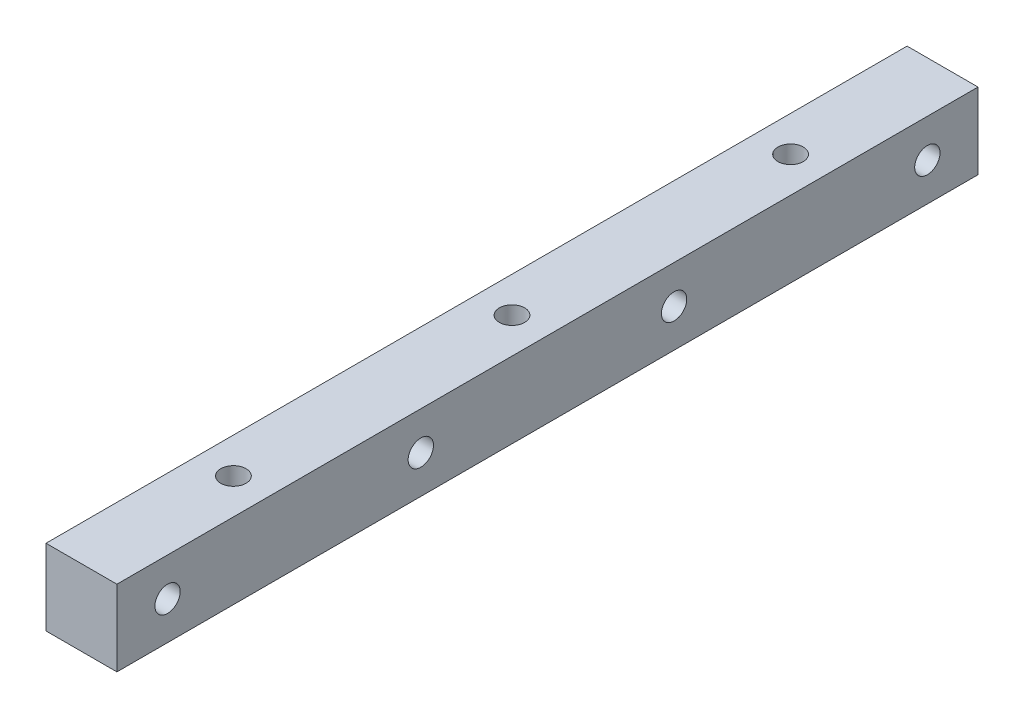
ISO-10303-21;
HEADER;
FILE_DESCRIPTION(('STEP AP214'),'2;1');
FILE_NAME('part.step','',(''),(''),'','','');
FILE_SCHEMA(('AUTOMOTIVE_DESIGN { 1 0 10303 214 1 1 1 1 }'));
ENDSEC;
DATA;
#1=APPLICATION_CONTEXT('core data for automotive mechanical design processes');
#2=APPLICATION_PROTOCOL_DEFINITION('international standard','automotive_design',2000,#1);
#3=PRODUCT_CONTEXT('',#1,'mechanical');
#4=PRODUCT('Part','Part','',(#3));
#5=PRODUCT_RELATED_PRODUCT_CATEGORY('part','',(#4));
#6=PRODUCT_DEFINITION_FORMATION('','',#4);
#7=PRODUCT_DEFINITION_CONTEXT('part definition',#1,'design');
#8=PRODUCT_DEFINITION('design','',#6,#7);
#9=PRODUCT_DEFINITION_SHAPE('','',#8);
#10=(LENGTH_UNIT() NAMED_UNIT(*) SI_UNIT(.MILLI.,.METRE.));
#11=(NAMED_UNIT(*) PLANE_ANGLE_UNIT() SI_UNIT($,.RADIAN.));
#12=(NAMED_UNIT(*) SI_UNIT($,.STERADIAN.) SOLID_ANGLE_UNIT());
#13=UNCERTAINTY_MEASURE_WITH_UNIT(LENGTH_MEASURE(1.E-05),#10,'distance_accuracy_value','');
#14=(GEOMETRIC_REPRESENTATION_CONTEXT(3) GLOBAL_UNCERTAINTY_ASSIGNED_CONTEXT((#13)) GLOBAL_UNIT_ASSIGNED_CONTEXT((#10,
#11,#12)) REPRESENTATION_CONTEXT('',''));
#15=CARTESIAN_POINT('',(0.,0.,0.));
#16=DIRECTION('',(0.,0.,1.));
#17=DIRECTION('',(1.,0.,0.));
#18=AXIS2_PLACEMENT_3D('',#15,#16,#17);
#19=CARTESIAN_POINT('',(2.8,0.,34.));
#20=DIRECTION('',(0.,1.,0.));
#21=DIRECTION('',(-1.,0.,0.));
#22=AXIS2_PLACEMENT_3D('',#19,#20,#21);
#23=PLANE('',#22);
#24=CARTESIAN_POINT('',(0.,0.,-22.));
#25=DIRECTION('',(0.,-1.,0.));
#26=DIRECTION('',(1.,0.,0.));
#27=AXIS2_PLACEMENT_3D('',#24,#25,#26);
#28=CIRCLE('',#27,1.);
#29=CARTESIAN_POINT('',(1.,0.,-22.));
#30=VERTEX_POINT('',#29);
#31=EDGE_CURVE('E121',#30,#30,#28,.T.);
#32=ORIENTED_EDGE('',*,*,#31,.F.);
#33=EDGE_LOOP('',(#32));
#34=FACE_BOUND('',#33,.T.);
#35=CARTESIAN_POINT('',(0.,0.,22.));
#36=DIRECTION('',(0.,-1.,0.));
#37=DIRECTION('',(1.,0.,0.));
#38=AXIS2_PLACEMENT_3D('',#35,#36,#37);
#39=CIRCLE('',#38,1.);
#40=CARTESIAN_POINT('',(1.,0.,22.));
#41=VERTEX_POINT('',#40);
#42=EDGE_CURVE('E120',#41,#41,#39,.T.);
#43=ORIENTED_EDGE('',*,*,#42,.F.);
#44=EDGE_LOOP('',(#43));
#45=FACE_BOUND('',#44,.T.);
#46=CARTESIAN_POINT('',(0.,0.,0.));
#47=DIRECTION('',(0.,-1.,0.));
#48=DIRECTION('',(1.,0.,0.));
#49=AXIS2_PLACEMENT_3D('',#46,#47,#48);
#50=CIRCLE('',#49,1.);
#51=CARTESIAN_POINT('',(1.,0.,0.));
#52=VERTEX_POINT('',#51);
#53=EDGE_CURVE('E113',#52,#52,#50,.T.);
#54=ORIENTED_EDGE('',*,*,#53,.F.);
#55=EDGE_LOOP('',(#54));
#56=FACE_BOUND('',#55,.T.);
#57=DIRECTION('',(1.,0.,0.));
#58=VECTOR('',#57,1.);
#59=CARTESIAN_POINT('',(2.8,0.,-34.));
#60=LINE('',#59,#58);
#61=CARTESIAN_POINT('',(-2.8,0.,-34.));
#62=VERTEX_POINT('',#61);
#63=CARTESIAN_POINT('',(2.8,0.,-34.));
#64=VERTEX_POINT('',#63);
#65=EDGE_CURVE('E97',#62,#64,#60,.T.);
#66=ORIENTED_EDGE('',*,*,#65,.T.);
#67=DIRECTION('',(0.,0.,-1.));
#68=VECTOR('',#67,1.);
#69=CARTESIAN_POINT('',(2.8,0.,34.));
#70=LINE('',#69,#68);
#71=CARTESIAN_POINT('',(2.8,0.,34.));
#72=VERTEX_POINT('',#71);
#73=EDGE_CURVE('E11',#72,#64,#70,.T.);
#74=ORIENTED_EDGE('',*,*,#73,.F.);
#75=DIRECTION('',(1.,0.,0.));
#76=VECTOR('',#75,1.);
#77=CARTESIAN_POINT('',(2.8,0.,34.));
#78=LINE('',#77,#76);
#79=CARTESIAN_POINT('',(-2.8,0.,34.));
#80=VERTEX_POINT('',#79);
#81=EDGE_CURVE('E85',#80,#72,#78,.T.);
#82=ORIENTED_EDGE('',*,*,#81,.F.);
#83=DIRECTION('',(0.,0.,-1.));
#84=VECTOR('',#83,1.);
#85=CARTESIAN_POINT('',(-2.8,0.,34.));
#86=LINE('',#85,#84);
#87=EDGE_CURVE('E93',#80,#62,#86,.T.);
#88=ORIENTED_EDGE('',*,*,#87,.T.);
#89=EDGE_LOOP('',(#66,#74,#82,#88));
#90=FACE_BOUND('',#89,.T.);
#91=ADVANCED_FACE('F34',(#34,#45,#56,#90),#23,.F.);
#92=CARTESIAN_POINT('',(2.8,6.,34.));
#93=DIRECTION('',(-1.,0.,0.));
#94=DIRECTION('',(0.,-1.,0.));
#95=AXIS2_PLACEMENT_3D('',#92,#93,#94);
#96=PLANE('',#95);
#97=CARTESIAN_POINT('',(2.8,3.,30.));
#98=DIRECTION('',(1.,0.,0.));
#99=DIRECTION('',(0.,1.,0.));
#100=AXIS2_PLACEMENT_3D('',#97,#98,#99);
#101=CIRCLE('',#100,1.);
#102=CARTESIAN_POINT('',(2.8,4.,30.));
#103=VERTEX_POINT('',#102);
#104=EDGE_CURVE('E145',#103,#103,#101,.T.);
#105=ORIENTED_EDGE('',*,*,#104,.F.);
#106=EDGE_LOOP('',(#105));
#107=FACE_BOUND('',#106,.T.);
#108=CARTESIAN_POINT('',(2.8,3.,10.));
#109=DIRECTION('',(1.,0.,0.));
#110=DIRECTION('',(0.,1.,0.));
#111=AXIS2_PLACEMENT_3D('',#108,#109,#110);
#112=CIRCLE('',#111,1.);
#113=CARTESIAN_POINT('',(2.8,4.,10.));
#114=VERTEX_POINT('',#113);
#115=EDGE_CURVE('E139',#114,#114,#112,.T.);
#116=ORIENTED_EDGE('',*,*,#115,.F.);
#117=EDGE_LOOP('',(#116));
#118=FACE_BOUND('',#117,.T.);
#119=CARTESIAN_POINT('',(2.8,3.,-10.));
#120=DIRECTION('',(1.,0.,0.));
#121=DIRECTION('',(0.,-1.,0.));
#122=AXIS2_PLACEMENT_3D('',#119,#120,#121);
#123=CIRCLE('',#122,1.);
#124=CARTESIAN_POINT('',(2.8,2.,-10.));
#125=VERTEX_POINT('',#124);
#126=EDGE_CURVE('E132',#125,#125,#123,.T.);
#127=ORIENTED_EDGE('',*,*,#126,.F.);
#128=EDGE_LOOP('',(#127));
#129=FACE_BOUND('',#128,.T.);
#130=CARTESIAN_POINT('',(2.8,3.,-30.));
#131=DIRECTION('',(1.,0.,0.));
#132=DIRECTION('',(0.,-1.,0.));
#133=AXIS2_PLACEMENT_3D('',#130,#131,#132);
#134=CIRCLE('',#133,1.);
#135=CARTESIAN_POINT('',(2.8,2.,-30.));
#136=VERTEX_POINT('',#135);
#137=EDGE_CURVE('E133',#136,#136,#134,.T.);
#138=ORIENTED_EDGE('',*,*,#137,.F.);
#139=EDGE_LOOP('',(#138));
#140=FACE_BOUND('',#139,.T.);
#141=DIRECTION('',(0.,1.,0.));
#142=VECTOR('',#141,1.);
#143=CARTESIAN_POINT('',(2.8,6.,-34.));
#144=LINE('',#143,#142);
#145=CARTESIAN_POINT('',(2.8,6.,-34.));
#146=VERTEX_POINT('',#145);
#147=EDGE_CURVE('E89',#64,#146,#144,.T.);
#148=ORIENTED_EDGE('',*,*,#147,.T.);
#149=DIRECTION('',(0.,0.,-1.));
#150=VECTOR('',#149,1.);
#151=CARTESIAN_POINT('',(2.8,6.,34.));
#152=LINE('',#151,#150);
#153=CARTESIAN_POINT('',(2.8,6.,34.));
#154=VERTEX_POINT('',#153);
#155=EDGE_CURVE('E42',#154,#146,#152,.T.);
#156=ORIENTED_EDGE('',*,*,#155,.F.);
#157=DIRECTION('',(0.,1.,0.));
#158=VECTOR('',#157,1.);
#159=CARTESIAN_POINT('',(2.8,6.,34.));
#160=LINE('',#159,#158);
#161=EDGE_CURVE('E80',#72,#154,#160,.T.);
#162=ORIENTED_EDGE('',*,*,#161,.F.);
#163=ORIENTED_EDGE('',*,*,#73,.T.);
#164=EDGE_LOOP('',(#148,#156,#162,#163));
#165=FACE_BOUND('',#164,.T.);
#166=ADVANCED_FACE('F88',(#107,#118,#129,#140,#165),#96,.F.);
#167=CARTESIAN_POINT('',(-2.8,6.,34.));
#168=DIRECTION('',(0.,-1.,0.));
#169=DIRECTION('',(1.,0.,0.));
#170=AXIS2_PLACEMENT_3D('',#167,#168,#169);
#171=PLANE('',#170);
#172=CARTESIAN_POINT('',(0.,6.,-22.));
#173=DIRECTION('',(0.,-1.,0.));
#174=DIRECTION('',(1.,0.,0.));
#175=AXIS2_PLACEMENT_3D('',#172,#173,#174);
#176=CIRCLE('',#175,1.);
#177=CARTESIAN_POINT('',(1.,6.,-22.));
#178=VERTEX_POINT('',#177);
#179=EDGE_CURVE('E117',#178,#178,#176,.F.);
#180=ORIENTED_EDGE('',*,*,#179,.F.);
#181=EDGE_LOOP('',(#180));
#182=FACE_BOUND('',#181,.T.);
#183=CARTESIAN_POINT('',(0.,6.,22.));
#184=DIRECTION('',(0.,-1.,0.));
#185=DIRECTION('',(1.,0.,0.));
#186=AXIS2_PLACEMENT_3D('',#183,#184,#185);
#187=CIRCLE('',#186,1.);
#188=CARTESIAN_POINT('',(1.,6.,22.));
#189=VERTEX_POINT('',#188);
#190=EDGE_CURVE('E116',#189,#189,#187,.F.);
#191=ORIENTED_EDGE('',*,*,#190,.F.);
#192=EDGE_LOOP('',(#191));
#193=FACE_BOUND('',#192,.T.);
#194=CARTESIAN_POINT('',(0.,6.,0.));
#195=DIRECTION('',(0.,-1.,0.));
#196=DIRECTION('',(1.,0.,0.));
#197=AXIS2_PLACEMENT_3D('',#194,#195,#196);
#198=CIRCLE('',#197,1.);
#199=CARTESIAN_POINT('',(1.,6.,0.));
#200=VERTEX_POINT('',#199);
#201=EDGE_CURVE('E100',#200,#200,#198,.F.);
#202=ORIENTED_EDGE('',*,*,#201,.F.);
#203=EDGE_LOOP('',(#202));
#204=FACE_BOUND('',#203,.T.);
#205=DIRECTION('',(-1.,0.,0.));
#206=VECTOR('',#205,1.);
#207=CARTESIAN_POINT('',(-2.8,6.,-34.));
#208=LINE('',#207,#206);
#209=CARTESIAN_POINT('',(-2.8,6.,-34.));
#210=VERTEX_POINT('',#209);
#211=EDGE_CURVE('E67',#146,#210,#208,.T.);
#212=ORIENTED_EDGE('',*,*,#211,.T.);
#213=DIRECTION('',(0.,0.,-1.));
#214=VECTOR('',#213,1.);
#215=CARTESIAN_POINT('',(-2.8,6.,34.));
#216=LINE('',#215,#214);
#217=CARTESIAN_POINT('',(-2.8,6.,34.));
#218=VERTEX_POINT('',#217);
#219=EDGE_CURVE('E90',#218,#210,#216,.T.);
#220=ORIENTED_EDGE('',*,*,#219,.F.);
#221=DIRECTION('',(-1.,0.,0.));
#222=VECTOR('',#221,1.);
#223=CARTESIAN_POINT('',(-2.8,6.,34.));
#224=LINE('',#223,#222);
#225=EDGE_CURVE('E83',#154,#218,#224,.T.);
#226=ORIENTED_EDGE('',*,*,#225,.F.);
#227=ORIENTED_EDGE('',*,*,#155,.T.);
#228=EDGE_LOOP('',(#212,#220,#226,#227));
#229=FACE_BOUND('',#228,.T.);
#230=ADVANCED_FACE('F91',(#182,#193,#204,#229),#171,.F.);
#231=CARTESIAN_POINT('',(-2.8,0.,34.));
#232=DIRECTION('',(1.,0.,0.));
#233=DIRECTION('',(0.,1.,0.));
#234=AXIS2_PLACEMENT_3D('',#231,#232,#233);
#235=PLANE('',#234);
#236=CARTESIAN_POINT('',(-2.8,3.,30.));
#237=DIRECTION('',(1.,0.,0.));
#238=DIRECTION('',(0.,1.,0.));
#239=AXIS2_PLACEMENT_3D('',#236,#237,#238);
#240=CIRCLE('',#239,1.);
#241=CARTESIAN_POINT('',(-2.8,4.,30.));
#242=VERTEX_POINT('',#241);
#243=EDGE_CURVE('E124',#242,#242,#240,.F.);
#244=ORIENTED_EDGE('',*,*,#243,.F.);
#245=EDGE_LOOP('',(#244));
#246=FACE_BOUND('',#245,.T.);
#247=CARTESIAN_POINT('',(-2.8,3.,10.));
#248=DIRECTION('',(1.,0.,0.));
#249=DIRECTION('',(0.,1.,0.));
#250=AXIS2_PLACEMENT_3D('',#247,#248,#249);
#251=CIRCLE('',#250,1.);
#252=CARTESIAN_POINT('',(-2.8,4.,10.));
#253=VERTEX_POINT('',#252);
#254=EDGE_CURVE('E142',#253,#253,#251,.F.);
#255=ORIENTED_EDGE('',*,*,#254,.F.);
#256=EDGE_LOOP('',(#255));
#257=FACE_BOUND('',#256,.T.);
#258=CARTESIAN_POINT('',(-2.8,3.,-10.));
#259=DIRECTION('',(1.,0.,0.));
#260=DIRECTION('',(0.,1.,0.));
#261=AXIS2_PLACEMENT_3D('',#258,#259,#260);
#262=CIRCLE('',#261,1.);
#263=CARTESIAN_POINT('',(-2.8,4.,-10.));
#264=VERTEX_POINT('',#263);
#265=EDGE_CURVE('E136',#264,#264,#262,.F.);
#266=ORIENTED_EDGE('',*,*,#265,.F.);
#267=EDGE_LOOP('',(#266));
#268=FACE_BOUND('',#267,.T.);
#269=CARTESIAN_POINT('',(-2.8,3.,-30.));
#270=DIRECTION('',(1.,0.,0.));
#271=DIRECTION('',(0.,1.,0.));
#272=AXIS2_PLACEMENT_3D('',#269,#270,#271);
#273=CIRCLE('',#272,1.);
#274=CARTESIAN_POINT('',(-2.8,4.,-30.));
#275=VERTEX_POINT('',#274);
#276=EDGE_CURVE('E129',#275,#275,#273,.F.);
#277=ORIENTED_EDGE('',*,*,#276,.F.);
#278=EDGE_LOOP('',(#277));
#279=FACE_BOUND('',#278,.T.);
#280=DIRECTION('',(0.,-1.,0.));
#281=VECTOR('',#280,1.);
#282=CARTESIAN_POINT('',(-2.8,0.,-34.));
#283=LINE('',#282,#281);
#284=EDGE_CURVE('E73',#210,#62,#283,.T.);
#285=ORIENTED_EDGE('',*,*,#284,.T.);
#286=ORIENTED_EDGE('',*,*,#87,.F.);
#287=DIRECTION('',(0.,-1.,0.));
#288=VECTOR('',#287,1.);
#289=CARTESIAN_POINT('',(-2.8,0.,34.));
#290=LINE('',#289,#288);
#291=EDGE_CURVE('E50',#218,#80,#290,.T.);
#292=ORIENTED_EDGE('',*,*,#291,.F.);
#293=ORIENTED_EDGE('',*,*,#219,.T.);
#294=EDGE_LOOP('',(#285,#286,#292,#293));
#295=FACE_BOUND('',#294,.T.);
#296=ADVANCED_FACE('F105',(#246,#257,#268,#279,#295),#235,.F.);
#297=CARTESIAN_POINT('',(0.,0.,34.));
#298=DIRECTION('',(0.,0.,-1.));
#299=DIRECTION('',(-1.,0.,0.));
#300=AXIS2_PLACEMENT_3D('',#297,#298,#299);
#301=PLANE('',#300);
#302=ORIENTED_EDGE('',*,*,#81,.T.);
#303=ORIENTED_EDGE('',*,*,#161,.T.);
#304=ORIENTED_EDGE('',*,*,#225,.T.);
#305=ORIENTED_EDGE('',*,*,#291,.T.);
#306=EDGE_LOOP('',(#302,#303,#304,#305));
#307=FACE_BOUND('',#306,.T.);
#308=ADVANCED_FACE('F81',(#307),#301,.F.);
#309=CARTESIAN_POINT('',(0.,0.,-34.));
#310=DIRECTION('',(0.,0.,-1.));
#311=DIRECTION('',(-1.,0.,0.));
#312=AXIS2_PLACEMENT_3D('',#309,#310,#311);
#313=PLANE('',#312);
#314=ORIENTED_EDGE('',*,*,#65,.F.);
#315=ORIENTED_EDGE('',*,*,#284,.F.);
#316=ORIENTED_EDGE('',*,*,#211,.F.);
#317=ORIENTED_EDGE('',*,*,#147,.F.);
#318=EDGE_LOOP('',(#314,#315,#316,#317));
#319=FACE_BOUND('',#318,.T.);
#320=ADVANCED_FACE('F108',(#319),#313,.T.);
#321=CARTESIAN_POINT('',(0.,6.001,0.));
#322=DIRECTION('',(0.,-1.,0.));
#323=DIRECTION('',(1.,0.,0.));
#324=AXIS2_PLACEMENT_3D('',#321,#322,#323);
#325=CYLINDRICAL_SURFACE('',#324,1.);
#326=ORIENTED_EDGE('',*,*,#53,.T.);
#327=EDGE_LOOP('',(#326));
#328=FACE_BOUND('',#327,.T.);
#329=ORIENTED_EDGE('',*,*,#201,.T.);
#330=EDGE_LOOP('',(#329));
#331=FACE_BOUND('',#330,.T.);
#332=ADVANCED_FACE('F195',(#328,#331),#325,.F.);
#333=CARTESIAN_POINT('',(0.,6.001,22.));
#334=DIRECTION('',(0.,-1.,0.));
#335=DIRECTION('',(1.,0.,0.));
#336=AXIS2_PLACEMENT_3D('',#333,#334,#335);
#337=CYLINDRICAL_SURFACE('',#336,1.);
#338=ORIENTED_EDGE('',*,*,#42,.T.);
#339=EDGE_LOOP('',(#338));
#340=FACE_BOUND('',#339,.T.);
#341=ORIENTED_EDGE('',*,*,#190,.T.);
#342=EDGE_LOOP('',(#341));
#343=FACE_BOUND('',#342,.T.);
#344=ADVANCED_FACE('F198',(#340,#343),#337,.F.);
#345=CARTESIAN_POINT('',(0.,6.001,-22.));
#346=DIRECTION('',(0.,-1.,0.));
#347=DIRECTION('',(1.,0.,0.));
#348=AXIS2_PLACEMENT_3D('',#345,#346,#347);
#349=CYLINDRICAL_SURFACE('',#348,1.);
#350=ORIENTED_EDGE('',*,*,#31,.T.);
#351=EDGE_LOOP('',(#350));
#352=FACE_BOUND('',#351,.T.);
#353=ORIENTED_EDGE('',*,*,#179,.T.);
#354=EDGE_LOOP('',(#353));
#355=FACE_BOUND('',#354,.T.);
#356=ADVANCED_FACE('F168',(#352,#355),#349,.F.);
#357=CARTESIAN_POINT('',(-2.801,3.,-30.));
#358=DIRECTION('',(1.,0.,0.));
#359=DIRECTION('',(0.,1.,0.));
#360=AXIS2_PLACEMENT_3D('',#357,#358,#359);
#361=CYLINDRICAL_SURFACE('',#360,1.);
#362=ORIENTED_EDGE('',*,*,#137,.T.);
#363=EDGE_LOOP('',(#362));
#364=FACE_BOUND('',#363,.T.);
#365=ORIENTED_EDGE('',*,*,#276,.T.);
#366=EDGE_LOOP('',(#365));
#367=FACE_BOUND('',#366,.T.);
#368=ADVANCED_FACE('F164',(#364,#367),#361,.F.);
#369=CARTESIAN_POINT('',(-2.801,3.,-10.));
#370=DIRECTION('',(1.,0.,0.));
#371=DIRECTION('',(0.,1.,0.));
#372=AXIS2_PLACEMENT_3D('',#369,#370,#371);
#373=CYLINDRICAL_SURFACE('',#372,1.);
#374=ORIENTED_EDGE('',*,*,#126,.T.);
#375=EDGE_LOOP('',(#374));
#376=FACE_BOUND('',#375,.T.);
#377=ORIENTED_EDGE('',*,*,#265,.T.);
#378=EDGE_LOOP('',(#377));
#379=FACE_BOUND('',#378,.T.);
#380=ADVANCED_FACE('F167',(#376,#379),#373,.F.);
#381=CARTESIAN_POINT('',(-2.801,3.,10.));
#382=DIRECTION('',(1.,0.,0.));
#383=DIRECTION('',(0.,1.,0.));
#384=AXIS2_PLACEMENT_3D('',#381,#382,#383);
#385=CYLINDRICAL_SURFACE('',#384,1.);
#386=ORIENTED_EDGE('',*,*,#115,.T.);
#387=EDGE_LOOP('',(#386));
#388=FACE_BOUND('',#387,.T.);
#389=ORIENTED_EDGE('',*,*,#254,.T.);
#390=EDGE_LOOP('',(#389));
#391=FACE_BOUND('',#390,.T.);
#392=ADVANCED_FACE('F214',(#388,#391),#385,.F.);
#393=CARTESIAN_POINT('',(-2.801,3.,30.));
#394=DIRECTION('',(1.,0.,0.));
#395=DIRECTION('',(0.,1.,0.));
#396=AXIS2_PLACEMENT_3D('',#393,#394,#395);
#397=CYLINDRICAL_SURFACE('',#396,1.);
#398=ORIENTED_EDGE('',*,*,#104,.T.);
#399=EDGE_LOOP('',(#398));
#400=FACE_BOUND('',#399,.T.);
#401=ORIENTED_EDGE('',*,*,#243,.T.);
#402=EDGE_LOOP('',(#401));
#403=FACE_BOUND('',#402,.T.);
#404=ADVANCED_FACE('F153',(#400,#403),#397,.F.);
#405=CLOSED_SHELL('',(#91,#166,#230,#296,#308,#320,#332,#344,#356,#368,#380,#392,#404));
#406=MANIFOLD_SOLID_BREP('B2',#405);
#407=ADVANCED_BREP_SHAPE_REPRESENTATION('',(#18,#406),#14);
#408=SHAPE_DEFINITION_REPRESENTATION(#9,#407);
ENDSEC;
END-ISO-10303-21;
